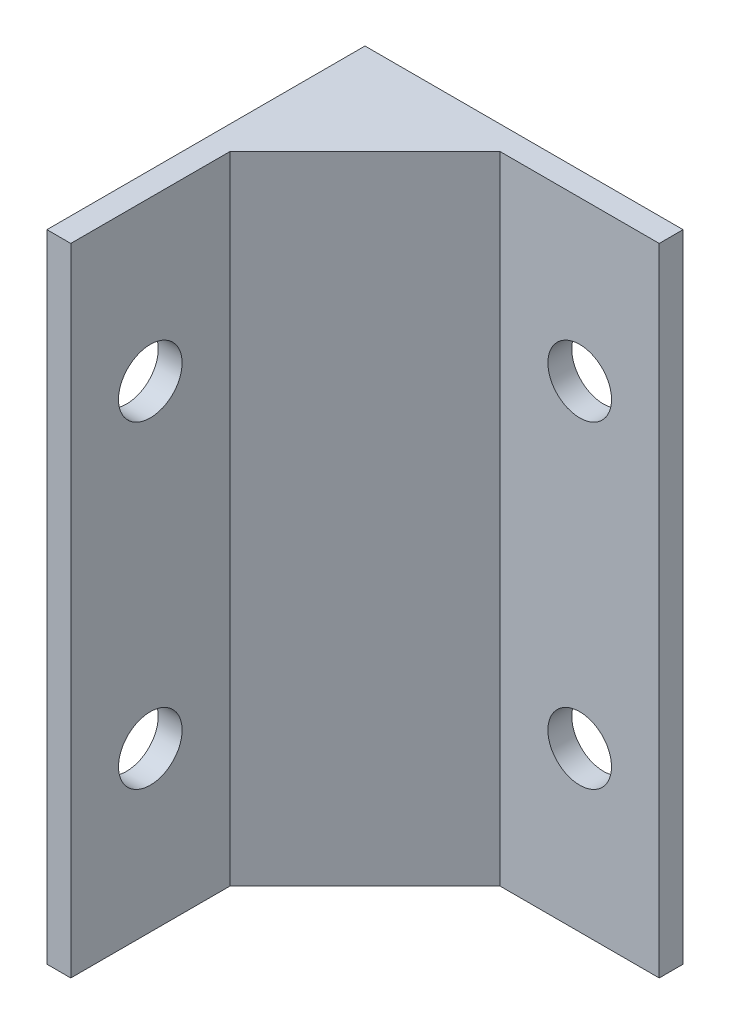
ISO-10303-21;
HEADER;
FILE_DESCRIPTION(('STEP AP214'),'2;1');
FILE_NAME('part.step','',(''),(''),'','','');
FILE_SCHEMA(('AUTOMOTIVE_DESIGN { 1 0 10303 214 1 1 1 1 }'));
ENDSEC;
DATA;
#1=APPLICATION_CONTEXT('core data for automotive mechanical design processes');
#2=APPLICATION_PROTOCOL_DEFINITION('international standard','automotive_design',2000,#1);
#3=PRODUCT_CONTEXT('',#1,'mechanical');
#4=PRODUCT('Part','Part','',(#3));
#5=PRODUCT_RELATED_PRODUCT_CATEGORY('part','',(#4));
#6=PRODUCT_DEFINITION_FORMATION('','',#4);
#7=PRODUCT_DEFINITION_CONTEXT('part definition',#1,'design');
#8=PRODUCT_DEFINITION('design','',#6,#7);
#9=PRODUCT_DEFINITION_SHAPE('','',#8);
#10=(LENGTH_UNIT() NAMED_UNIT(*) SI_UNIT(.MILLI.,.METRE.));
#11=(NAMED_UNIT(*) PLANE_ANGLE_UNIT() SI_UNIT($,.RADIAN.));
#12=(NAMED_UNIT(*) SI_UNIT($,.STERADIAN.) SOLID_ANGLE_UNIT());
#13=UNCERTAINTY_MEASURE_WITH_UNIT(LENGTH_MEASURE(1.E-05),#10,'distance_accuracy_value','');
#14=(GEOMETRIC_REPRESENTATION_CONTEXT(3) GLOBAL_UNCERTAINTY_ASSIGNED_CONTEXT((#13)) GLOBAL_UNIT_ASSIGNED_CONTEXT((#10,
#11,#12)) REPRESENTATION_CONTEXT('',''));
#15=CARTESIAN_POINT('',(0.,0.,0.));
#16=DIRECTION('',(0.,0.,1.));
#17=DIRECTION('',(1.,0.,0.));
#18=AXIS2_PLACEMENT_3D('',#15,#16,#17);
#19=CARTESIAN_POINT('',(20.,80.,20.));
#20=DIRECTION('',(-1.,0.,0.));
#21=DIRECTION('',(0.,0.,1.));
#22=AXIS2_PLACEMENT_3D('',#19,#20,#21);
#23=PLANE('',#22);
#24=DIRECTION('',(0.,0.,-1.));
#25=VECTOR('',#24,1.);
#26=CARTESIAN_POINT('',(20.,80.,20.));
#27=LINE('',#26,#25);
#28=CARTESIAN_POINT('',(20.,80.,-17.));
#29=VERTEX_POINT('',#28);
#30=CARTESIAN_POINT('',(20.,80.,-20.));
#31=VERTEX_POINT('',#30);
#32=EDGE_CURVE('E85',#29,#31,#27,.T.);
#33=ORIENTED_EDGE('',*,*,#32,.F.);
#34=DIRECTION('',(0.,-1.,0.));
#35=VECTOR('',#34,1.);
#36=CARTESIAN_POINT('',(20.,80.000012,-17.));
#37=LINE('',#36,#35);
#38=CARTESIAN_POINT('',(20.,0.,-17.));
#39=VERTEX_POINT('',#38);
#40=EDGE_CURVE('E146',#29,#39,#37,.T.);
#41=ORIENTED_EDGE('',*,*,#40,.T.);
#42=DIRECTION('',(0.,0.,-1.));
#43=VECTOR('',#42,1.);
#44=CARTESIAN_POINT('',(20.,0.,20.));
#45=LINE('',#44,#43);
#46=CARTESIAN_POINT('',(20.,0.,-20.));
#47=VERTEX_POINT('',#46);
#48=EDGE_CURVE('E132',#39,#47,#45,.T.);
#49=ORIENTED_EDGE('',*,*,#48,.T.);
#50=DIRECTION('',(0.,-1.,0.));
#51=VECTOR('',#50,1.);
#52=CARTESIAN_POINT('',(20.,80.,-20.));
#53=LINE('',#52,#51);
#54=EDGE_CURVE('E11',#31,#47,#53,.T.);
#55=ORIENTED_EDGE('',*,*,#54,.F.);
#56=EDGE_LOOP('',(#33,#41,#49,#55));
#57=FACE_BOUND('',#56,.T.);
#58=ADVANCED_FACE('F39',(#57),#23,.F.);
#59=CARTESIAN_POINT('',(-20.,80.,-20.));
#60=DIRECTION('',(0.,0.,1.));
#61=DIRECTION('',(1.,0.,0.));
#62=AXIS2_PLACEMENT_3D('',#59,#60,#61);
#63=PLANE('',#62);
#64=CARTESIAN_POINT('',(10.,60.,-20.));
#65=DIRECTION('',(0.,0.,1.));
#66=DIRECTION('',(1.,0.,0.));
#67=AXIS2_PLACEMENT_3D('',#64,#65,#66);
#68=CIRCLE('',#67,4.);
#69=CARTESIAN_POINT('',(14.,60.,-20.));
#70=VERTEX_POINT('',#69);
#71=EDGE_CURVE('E134',#70,#70,#68,.T.);
#72=ORIENTED_EDGE('',*,*,#71,.T.);
#73=EDGE_LOOP('',(#72));
#74=FACE_BOUND('',#73,.T.);
#75=CARTESIAN_POINT('',(10.,20.,-20.));
#76=DIRECTION('',(0.,0.,1.));
#77=DIRECTION('',(-1.,0.,0.));
#78=AXIS2_PLACEMENT_3D('',#75,#76,#77);
#79=CIRCLE('',#78,4.);
#80=CARTESIAN_POINT('',(6.00000000000001,20.,-20.));
#81=VERTEX_POINT('',#80);
#82=EDGE_CURVE('E240',#81,#81,#79,.T.);
#83=ORIENTED_EDGE('',*,*,#82,.T.);
#84=EDGE_LOOP('',(#83));
#85=FACE_BOUND('',#84,.T.);
#86=DIRECTION('',(-1.,0.,0.));
#87=VECTOR('',#86,1.);
#88=CARTESIAN_POINT('',(-20.,0.,-20.));
#89=LINE('',#88,#87);
#90=CARTESIAN_POINT('',(-20.,0.,-20.));
#91=VERTEX_POINT('',#90);
#92=EDGE_CURVE('E175',#47,#91,#89,.T.);
#93=ORIENTED_EDGE('',*,*,#92,.T.);
#94=DIRECTION('',(0.,-1.,0.));
#95=VECTOR('',#94,1.);
#96=CARTESIAN_POINT('',(-20.,80.,-20.));
#97=LINE('',#96,#95);
#98=CARTESIAN_POINT('',(-20.,80.,-20.));
#99=VERTEX_POINT('',#98);
#100=EDGE_CURVE('E47',#99,#91,#97,.T.);
#101=ORIENTED_EDGE('',*,*,#100,.F.);
#102=DIRECTION('',(-1.,0.,0.));
#103=VECTOR('',#102,1.);
#104=CARTESIAN_POINT('',(-20.,80.,-20.));
#105=LINE('',#104,#103);
#106=EDGE_CURVE('E163',#31,#99,#105,.T.);
#107=ORIENTED_EDGE('',*,*,#106,.F.);
#108=ORIENTED_EDGE('',*,*,#54,.T.);
#109=EDGE_LOOP('',(#93,#101,#107,#108));
#110=FACE_BOUND('',#109,.T.);
#111=ADVANCED_FACE('F209',(#74,#85,#110),#63,.F.);
#112=CARTESIAN_POINT('',(-20.,80.,20.));
#113=DIRECTION('',(1.,0.,0.));
#114=DIRECTION('',(0.,0.,-1.));
#115=AXIS2_PLACEMENT_3D('',#112,#113,#114);
#116=PLANE('',#115);
#117=CARTESIAN_POINT('',(-20.,60.,10.));
#118=DIRECTION('',(-1.,0.,0.));
#119=DIRECTION('',(0.,0.,1.));
#120=AXIS2_PLACEMENT_3D('',#117,#118,#119);
#121=CIRCLE('',#120,4.);
#122=CARTESIAN_POINT('',(-20.,60.,14.));
#123=VERTEX_POINT('',#122);
#124=EDGE_CURVE('E241',#123,#123,#121,.T.);
#125=ORIENTED_EDGE('',*,*,#124,.F.);
#126=EDGE_LOOP('',(#125));
#127=FACE_BOUND('',#126,.T.);
#128=CARTESIAN_POINT('',(-20.,20.,10.));
#129=DIRECTION('',(-1.,0.,0.));
#130=DIRECTION('',(0.,0.,-1.));
#131=AXIS2_PLACEMENT_3D('',#128,#129,#130);
#132=CIRCLE('',#131,4.);
#133=CARTESIAN_POINT('',(-20.,20.,6.00000000000001));
#134=VERTEX_POINT('',#133);
#135=EDGE_CURVE('E251',#134,#134,#132,.T.);
#136=ORIENTED_EDGE('',*,*,#135,.F.);
#137=EDGE_LOOP('',(#136));
#138=FACE_BOUND('',#137,.T.);
#139=DIRECTION('',(0.,0.,1.));
#140=VECTOR('',#139,1.);
#141=CARTESIAN_POINT('',(-20.,0.,20.));
#142=LINE('',#141,#140);
#143=CARTESIAN_POINT('',(-20.,0.,20.));
#144=VERTEX_POINT('',#143);
#145=EDGE_CURVE('E80',#91,#144,#142,.T.);
#146=ORIENTED_EDGE('',*,*,#145,.T.);
#147=DIRECTION('',(0.,-1.,0.));
#148=VECTOR('',#147,1.);
#149=CARTESIAN_POINT('',(-20.,80.,20.));
#150=LINE('',#149,#148);
#151=CARTESIAN_POINT('',(-20.,80.,20.));
#152=VERTEX_POINT('',#151);
#153=EDGE_CURVE('E172',#152,#144,#150,.T.);
#154=ORIENTED_EDGE('',*,*,#153,.F.);
#155=DIRECTION('',(0.,0.,1.));
#156=VECTOR('',#155,1.);
#157=CARTESIAN_POINT('',(-20.,80.,20.));
#158=LINE('',#157,#156);
#159=EDGE_CURVE('E63',#99,#152,#158,.T.);
#160=ORIENTED_EDGE('',*,*,#159,.F.);
#161=ORIENTED_EDGE('',*,*,#100,.T.);
#162=EDGE_LOOP('',(#146,#154,#160,#161));
#163=FACE_BOUND('',#162,.T.);
#164=ADVANCED_FACE('F186',(#127,#138,#163),#116,.F.);
#165=CARTESIAN_POINT('',(-20.,80.,20.));
#166=DIRECTION('',(0.,0.,-1.));
#167=DIRECTION('',(-1.,0.,0.));
#168=AXIS2_PLACEMENT_3D('',#165,#166,#167);
#169=PLANE('',#168);
#170=DIRECTION('',(1.,0.,0.));
#171=VECTOR('',#170,1.);
#172=CARTESIAN_POINT('',(-20.,0.,20.));
#173=LINE('',#172,#171);
#174=CARTESIAN_POINT('',(-17.,0.,20.));
#175=VERTEX_POINT('',#174);
#176=EDGE_CURVE('E164',#144,#175,#173,.T.);
#177=ORIENTED_EDGE('',*,*,#176,.T.);
#178=DIRECTION('',(0.,-1.,0.));
#179=VECTOR('',#178,1.);
#180=CARTESIAN_POINT('',(-17.,80.000012,20.));
#181=LINE('',#180,#179);
#182=CARTESIAN_POINT('',(-17.,80.,20.));
#183=VERTEX_POINT('',#182);
#184=EDGE_CURVE('E54',#183,#175,#181,.T.);
#185=ORIENTED_EDGE('',*,*,#184,.F.);
#186=DIRECTION('',(1.,0.,0.));
#187=VECTOR('',#186,1.);
#188=CARTESIAN_POINT('',(-20.,80.,20.));
#189=LINE('',#188,#187);
#190=EDGE_CURVE('E169',#152,#183,#189,.T.);
#191=ORIENTED_EDGE('',*,*,#190,.F.);
#192=ORIENTED_EDGE('',*,*,#153,.T.);
#193=EDGE_LOOP('',(#177,#185,#191,#192));
#194=FACE_BOUND('',#193,.T.);
#195=ADVANCED_FACE('F190',(#194),#169,.F.);
#196=CARTESIAN_POINT('',(0.,80.,0.));
#197=DIRECTION('',(0.,-1.,0.));
#198=DIRECTION('',(0.,0.,-1.));
#199=AXIS2_PLACEMENT_3D('',#196,#197,#198);
#200=PLANE('',#199);
#201=DIRECTION('',(0.707106781186548,0.,-0.707106781186548));
#202=VECTOR('',#201,1.);
#203=CARTESIAN_POINT('',(-8.5,80.,-8.5));
#204=LINE('',#203,#202);
#205=CARTESIAN_POINT('',(-17.,80.,0.));
#206=VERTEX_POINT('',#205);
#207=CARTESIAN_POINT('',(0.,80.,-17.));
#208=VERTEX_POINT('',#207);
#209=EDGE_CURVE('E156',#206,#208,#204,.T.);
#210=ORIENTED_EDGE('',*,*,#209,.T.);
#211=DIRECTION('',(1.,0.,0.));
#212=VECTOR('',#211,1.);
#213=CARTESIAN_POINT('',(0.,80.,-17.));
#214=LINE('',#213,#212);
#215=EDGE_CURVE('E114',#208,#29,#214,.T.);
#216=ORIENTED_EDGE('',*,*,#215,.T.);
#217=ORIENTED_EDGE('',*,*,#32,.T.);
#218=ORIENTED_EDGE('',*,*,#106,.T.);
#219=ORIENTED_EDGE('',*,*,#159,.T.);
#220=ORIENTED_EDGE('',*,*,#190,.T.);
#221=DIRECTION('',(0.,0.,-1.));
#222=VECTOR('',#221,1.);
#223=CARTESIAN_POINT('',(-17.,80.,0.));
#224=LINE('',#223,#222);
#225=EDGE_CURVE('E118',#183,#206,#224,.T.);
#226=ORIENTED_EDGE('',*,*,#225,.T.);
#227=EDGE_LOOP('',(#210,#216,#217,#218,#219,#220,#226));
#228=FACE_BOUND('',#227,.T.);
#229=ADVANCED_FACE('F192',(#228),#200,.F.);
#230=CARTESIAN_POINT('',(0.,0.,0.));
#231=DIRECTION('',(0.,-1.,0.));
#232=DIRECTION('',(0.,0.,-1.));
#233=AXIS2_PLACEMENT_3D('',#230,#231,#232);
#234=PLANE('',#233);
#235=DIRECTION('',(1.,0.,0.));
#236=VECTOR('',#235,1.);
#237=CARTESIAN_POINT('',(0.,0.,-17.));
#238=LINE('',#237,#236);
#239=CARTESIAN_POINT('',(0.,0.,-17.));
#240=VERTEX_POINT('',#239);
#241=EDGE_CURVE('E112',#240,#39,#238,.T.);
#242=ORIENTED_EDGE('',*,*,#241,.F.);
#243=DIRECTION('',(0.707106781186548,0.,-0.707106781186548));
#244=VECTOR('',#243,1.);
#245=CARTESIAN_POINT('',(-8.5,0.,-8.5));
#246=LINE('',#245,#244);
#247=CARTESIAN_POINT('',(-17.,0.,0.));
#248=VERTEX_POINT('',#247);
#249=EDGE_CURVE('E122',#248,#240,#246,.T.);
#250=ORIENTED_EDGE('',*,*,#249,.F.);
#251=DIRECTION('',(0.,0.,-1.));
#252=VECTOR('',#251,1.);
#253=CARTESIAN_POINT('',(-17.,0.,0.));
#254=LINE('',#253,#252);
#255=EDGE_CURVE('E127',#175,#248,#254,.T.);
#256=ORIENTED_EDGE('',*,*,#255,.F.);
#257=ORIENTED_EDGE('',*,*,#176,.F.);
#258=ORIENTED_EDGE('',*,*,#145,.F.);
#259=ORIENTED_EDGE('',*,*,#92,.F.);
#260=ORIENTED_EDGE('',*,*,#48,.F.);
#261=EDGE_LOOP('',(#242,#250,#256,#257,#258,#259,#260));
#262=FACE_BOUND('',#261,.T.);
#263=ADVANCED_FACE('F130',(#262),#234,.T.);
#264=CARTESIAN_POINT('',(0.,80.000012,-17.));
#265=DIRECTION('',(0.,0.,-1.));
#266=DIRECTION('',(-1.,0.,0.));
#267=AXIS2_PLACEMENT_3D('',#264,#265,#266);
#268=PLANE('',#267);
#269=CARTESIAN_POINT('',(10.,60.,-17.));
#270=DIRECTION('',(0.,0.,1.));
#271=DIRECTION('',(1.,0.,0.));
#272=AXIS2_PLACEMENT_3D('',#269,#270,#271);
#273=CIRCLE('',#272,4.);
#274=CARTESIAN_POINT('',(14.,60.,-17.));
#275=VERTEX_POINT('',#274);
#276=EDGE_CURVE('E138',#275,#275,#273,.T.);
#277=ORIENTED_EDGE('',*,*,#276,.F.);
#278=EDGE_LOOP('',(#277));
#279=FACE_BOUND('',#278,.T.);
#280=CARTESIAN_POINT('',(10.,20.,-17.));
#281=DIRECTION('',(0.,0.,1.));
#282=DIRECTION('',(-1.,0.,0.));
#283=AXIS2_PLACEMENT_3D('',#280,#281,#282);
#284=CIRCLE('',#283,4.);
#285=CARTESIAN_POINT('',(6.00000000000001,20.,-17.));
#286=VERTEX_POINT('',#285);
#287=EDGE_CURVE('E141',#286,#286,#284,.T.);
#288=ORIENTED_EDGE('',*,*,#287,.F.);
#289=EDGE_LOOP('',(#288));
#290=FACE_BOUND('',#289,.T.);
#291=DIRECTION('',(0.,-1.,0.));
#292=VECTOR('',#291,1.);
#293=CARTESIAN_POINT('',(0.,80.000012,-17.));
#294=LINE('',#293,#292);
#295=EDGE_CURVE('E108',#208,#240,#294,.T.);
#296=ORIENTED_EDGE('',*,*,#295,.T.);
#297=ORIENTED_EDGE('',*,*,#241,.T.);
#298=ORIENTED_EDGE('',*,*,#40,.F.);
#299=ORIENTED_EDGE('',*,*,#215,.F.);
#300=EDGE_LOOP('',(#296,#297,#298,#299));
#301=FACE_BOUND('',#300,.T.);
#302=ADVANCED_FACE('F110',(#279,#290,#301),#268,.F.);
#303=CARTESIAN_POINT('',(-8.5,80.000012,-8.5));
#304=DIRECTION('',(-0.707106781186548,0.,-0.707106781186548));
#305=DIRECTION('',(-0.707106781186548,0.,0.707106781186548));
#306=AXIS2_PLACEMENT_3D('',#303,#304,#305);
#307=PLANE('',#306);
#308=DIRECTION('',(0.,-1.,0.));
#309=VECTOR('',#308,1.);
#310=CARTESIAN_POINT('',(-17.,80.000012,0.));
#311=LINE('',#310,#309);
#312=EDGE_CURVE('E119',#206,#248,#311,.T.);
#313=ORIENTED_EDGE('',*,*,#312,.T.);
#314=ORIENTED_EDGE('',*,*,#249,.T.);
#315=ORIENTED_EDGE('',*,*,#295,.F.);
#316=ORIENTED_EDGE('',*,*,#209,.F.);
#317=EDGE_LOOP('',(#313,#314,#315,#316));
#318=FACE_BOUND('',#317,.T.);
#319=ADVANCED_FACE('F123',(#318),#307,.F.);
#320=CARTESIAN_POINT('',(-17.,80.000012,0.));
#321=DIRECTION('',(-1.,0.,0.));
#322=DIRECTION('',(0.,0.,1.));
#323=AXIS2_PLACEMENT_3D('',#320,#321,#322);
#324=PLANE('',#323);
#325=CARTESIAN_POINT('',(-17.,60.,10.));
#326=DIRECTION('',(-1.,0.,0.));
#327=DIRECTION('',(0.,0.,1.));
#328=AXIS2_PLACEMENT_3D('',#325,#326,#327);
#329=CIRCLE('',#328,4.);
#330=CARTESIAN_POINT('',(-17.,60.,14.));
#331=VERTEX_POINT('',#330);
#332=EDGE_CURVE('E246',#331,#331,#329,.T.);
#333=ORIENTED_EDGE('',*,*,#332,.T.);
#334=EDGE_LOOP('',(#333));
#335=FACE_BOUND('',#334,.T.);
#336=CARTESIAN_POINT('',(-17.,20.,10.));
#337=DIRECTION('',(-1.,0.,0.));
#338=DIRECTION('',(0.,0.,-1.));
#339=AXIS2_PLACEMENT_3D('',#336,#337,#338);
#340=CIRCLE('',#339,4.);
#341=CARTESIAN_POINT('',(-17.,20.,6.00000000000001));
#342=VERTEX_POINT('',#341);
#343=EDGE_CURVE('E257',#342,#342,#340,.T.);
#344=ORIENTED_EDGE('',*,*,#343,.T.);
#345=EDGE_LOOP('',(#344));
#346=FACE_BOUND('',#345,.T.);
#347=ORIENTED_EDGE('',*,*,#184,.T.);
#348=ORIENTED_EDGE('',*,*,#255,.T.);
#349=ORIENTED_EDGE('',*,*,#312,.F.);
#350=ORIENTED_EDGE('',*,*,#225,.F.);
#351=EDGE_LOOP('',(#347,#348,#349,#350));
#352=FACE_BOUND('',#351,.T.);
#353=ADVANCED_FACE('F193',(#335,#346,#352),#324,.F.);
#354=CARTESIAN_POINT('',(10.,20.,-20.));
#355=DIRECTION('',(0.,0.,1.));
#356=DIRECTION('',(1.,0.,0.));
#357=AXIS2_PLACEMENT_3D('',#354,#355,#356);
#358=CYLINDRICAL_SURFACE('',#357,4.);
#359=ORIENTED_EDGE('',*,*,#82,.F.);
#360=EDGE_LOOP('',(#359));
#361=FACE_BOUND('',#360,.T.);
#362=ORIENTED_EDGE('',*,*,#287,.T.);
#363=EDGE_LOOP('',(#362));
#364=FACE_BOUND('',#363,.T.);
#365=ADVANCED_FACE('F195',(#361,#364),#358,.F.);
#366=CARTESIAN_POINT('',(10.,60.,-20.));
#367=DIRECTION('',(0.,0.,1.));
#368=DIRECTION('',(1.,0.,0.));
#369=AXIS2_PLACEMENT_3D('',#366,#367,#368);
#370=CYLINDRICAL_SURFACE('',#369,4.);
#371=ORIENTED_EDGE('',*,*,#71,.F.);
#372=EDGE_LOOP('',(#371));
#373=FACE_BOUND('',#372,.T.);
#374=ORIENTED_EDGE('',*,*,#276,.T.);
#375=EDGE_LOOP('',(#374));
#376=FACE_BOUND('',#375,.T.);
#377=ADVANCED_FACE('F202',(#373,#376),#370,.F.);
#378=CARTESIAN_POINT('',(-20.,20.,10.));
#379=DIRECTION('',(1.,0.,0.));
#380=DIRECTION('',(0.,0.,-1.));
#381=AXIS2_PLACEMENT_3D('',#378,#379,#380);
#382=CYLINDRICAL_SURFACE('',#381,4.);
#383=ORIENTED_EDGE('',*,*,#135,.T.);
#384=EDGE_LOOP('',(#383));
#385=FACE_BOUND('',#384,.T.);
#386=ORIENTED_EDGE('',*,*,#343,.F.);
#387=EDGE_LOOP('',(#386));
#388=FACE_BOUND('',#387,.T.);
#389=ADVANCED_FACE('F264',(#385,#388),#382,.F.);
#390=CARTESIAN_POINT('',(-20.,60.,10.));
#391=DIRECTION('',(1.,0.,0.));
#392=DIRECTION('',(0.,0.,-1.));
#393=AXIS2_PLACEMENT_3D('',#390,#391,#392);
#394=CYLINDRICAL_SURFACE('',#393,4.);
#395=ORIENTED_EDGE('',*,*,#124,.T.);
#396=EDGE_LOOP('',(#395));
#397=FACE_BOUND('',#396,.T.);
#398=ORIENTED_EDGE('',*,*,#332,.F.);
#399=EDGE_LOOP('',(#398));
#400=FACE_BOUND('',#399,.T.);
#401=ADVANCED_FACE('F270',(#397,#400),#394,.F.);
#402=CLOSED_SHELL('',(#58,#111,#164,#195,#229,#263,#302,#319,#353,#365,#377,#389,#401));
#403=MANIFOLD_SOLID_BREP('B2',#402);
#404=ADVANCED_BREP_SHAPE_REPRESENTATION('',(#18,#403),#14);
#405=SHAPE_DEFINITION_REPRESENTATION(#9,#404);
ENDSEC;
END-ISO-10303-21;
